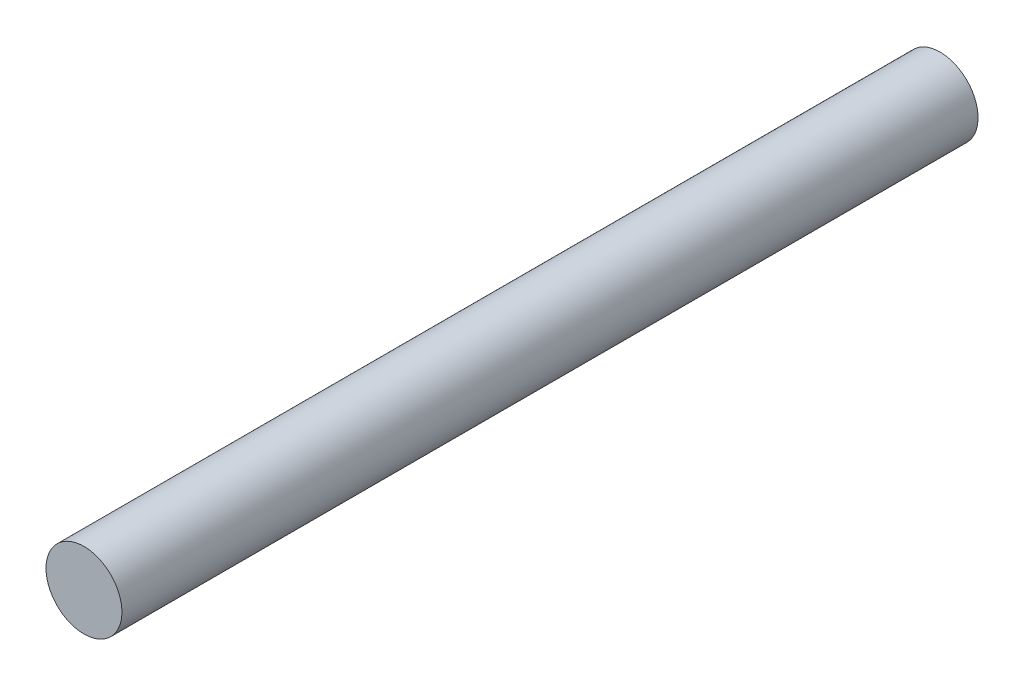
ISO-10303-21;
HEADER;
FILE_DESCRIPTION(('STEP AP214'),'2;1');
FILE_NAME('part.step','',(''),(''),'','','');
FILE_SCHEMA(('AUTOMOTIVE_DESIGN { 1 0 10303 214 1 1 1 1 }'));
ENDSEC;
DATA;
#1=APPLICATION_CONTEXT('core data for automotive mechanical design processes');
#2=APPLICATION_PROTOCOL_DEFINITION('international standard','automotive_design',2000,#1);
#3=PRODUCT_CONTEXT('',#1,'mechanical');
#4=PRODUCT('Part','Part','',(#3));
#5=PRODUCT_RELATED_PRODUCT_CATEGORY('part','',(#4));
#6=PRODUCT_DEFINITION_FORMATION('','',#4);
#7=PRODUCT_DEFINITION_CONTEXT('part definition',#1,'design');
#8=PRODUCT_DEFINITION('design','',#6,#7);
#9=PRODUCT_DEFINITION_SHAPE('','',#8);
#10=(LENGTH_UNIT() NAMED_UNIT(*) SI_UNIT(.MILLI.,.METRE.));
#11=(NAMED_UNIT(*) PLANE_ANGLE_UNIT() SI_UNIT($,.RADIAN.));
#12=(NAMED_UNIT(*) SI_UNIT($,.STERADIAN.) SOLID_ANGLE_UNIT());
#13=UNCERTAINTY_MEASURE_WITH_UNIT(LENGTH_MEASURE(1.E-05),#10,'distance_accuracy_value','');
#14=(GEOMETRIC_REPRESENTATION_CONTEXT(3) GLOBAL_UNCERTAINTY_ASSIGNED_CONTEXT((#13)) GLOBAL_UNIT_ASSIGNED_CONTEXT((#10,
#11,#12)) REPRESENTATION_CONTEXT('',''));
#15=CARTESIAN_POINT('',(0.,0.,0.));
#16=DIRECTION('',(0.,0.,1.));
#17=DIRECTION('',(1.,0.,0.));
#18=AXIS2_PLACEMENT_3D('',#15,#16,#17);
#19=CARTESIAN_POINT('',(0.,0.,76.2));
#20=DIRECTION('',(0.,0.,-1.));
#21=DIRECTION('',(-1.,0.,0.));
#22=AXIS2_PLACEMENT_3D('',#19,#20,#21);
#23=CYLINDRICAL_SURFACE('',#22,3.3782);
#24=CARTESIAN_POINT('',(0.,0.,76.2));
#25=DIRECTION('',(0.,0.,1.));
#26=DIRECTION('',(1.,0.,0.));
#27=AXIS2_PLACEMENT_3D('',#24,#25,#26);
#28=CIRCLE('',#27,3.3782);
#29=CARTESIAN_POINT('',(-3.3782,0.,76.2));
#30=VERTEX_POINT('',#29);
#31=EDGE_CURVE('E10',#30,#30,#28,.T.);
#32=CARTESIAN_POINT('',(0.,0.,0.));
#33=DIRECTION('',(0.,0.,1.));
#34=DIRECTION('',(1.,0.,0.));
#35=AXIS2_PLACEMENT_3D('',#32,#33,#34);
#36=CIRCLE('',#35,3.3782);
#37=CARTESIAN_POINT('',(-3.3782,0.,0.));
#38=VERTEX_POINT('',#37);
#39=EDGE_CURVE('E40',#38,#38,#36,.T.);
#40=CARTESIAN_POINT('',(-3.3782,0.,76.2));
#41=CARTESIAN_POINT('',(-3.3782,0.,75.40625));
#42=CARTESIAN_POINT('',(-3.3782,0.,74.6125));
#43=CARTESIAN_POINT('',(-3.3782,0.,73.025));
#44=CARTESIAN_POINT('',(-3.3782,0.,72.23125));
#45=CARTESIAN_POINT('',(-3.3782,0.,70.64375));
#46=CARTESIAN_POINT('',(-3.3782,0.,69.85));
#47=CARTESIAN_POINT('',(-3.3782,0.,68.2625));
#48=CARTESIAN_POINT('',(-3.3782,0.,67.46875));
#49=CARTESIAN_POINT('',(-3.3782,0.,65.88125));
#50=CARTESIAN_POINT('',(-3.3782,0.,65.0875));
#51=CARTESIAN_POINT('',(-3.3782,0.,63.5));
#52=CARTESIAN_POINT('',(-3.3782,0.,62.70625));
#53=CARTESIAN_POINT('',(-3.3782,0.,61.11875));
#54=CARTESIAN_POINT('',(-3.3782,0.,60.325));
#55=CARTESIAN_POINT('',(-3.3782,0.,58.7375));
#56=CARTESIAN_POINT('',(-3.3782,0.,57.94375));
#57=CARTESIAN_POINT('',(-3.3782,0.,56.35625));
#58=CARTESIAN_POINT('',(-3.3782,0.,55.5625));
#59=CARTESIAN_POINT('',(-3.3782,0.,53.975));
#60=CARTESIAN_POINT('',(-3.3782,0.,53.18125));
#61=CARTESIAN_POINT('',(-3.3782,0.,51.59375));
#62=CARTESIAN_POINT('',(-3.3782,0.,50.8));
#63=CARTESIAN_POINT('',(-3.3782,0.,49.2125));
#64=CARTESIAN_POINT('',(-3.3782,0.,48.41875));
#65=CARTESIAN_POINT('',(-3.3782,0.,46.83125));
#66=CARTESIAN_POINT('',(-3.3782,0.,46.0375));
#67=CARTESIAN_POINT('',(-3.3782,0.,44.45));
#68=CARTESIAN_POINT('',(-3.3782,0.,43.65625));
#69=CARTESIAN_POINT('',(-3.3782,0.,42.06875));
#70=CARTESIAN_POINT('',(-3.3782,0.,41.275));
#71=CARTESIAN_POINT('',(-3.3782,0.,39.6875));
#72=CARTESIAN_POINT('',(-3.3782,0.,38.89375));
#73=CARTESIAN_POINT('',(-3.3782,0.,37.30625));
#74=CARTESIAN_POINT('',(-3.3782,0.,36.5125));
#75=CARTESIAN_POINT('',(-3.3782,0.,34.925));
#76=CARTESIAN_POINT('',(-3.3782,0.,34.13125));
#77=CARTESIAN_POINT('',(-3.3782,0.,32.54375));
#78=CARTESIAN_POINT('',(-3.3782,0.,31.75));
#79=CARTESIAN_POINT('',(-3.3782,0.,30.1625));
#80=CARTESIAN_POINT('',(-3.3782,0.,29.36875));
#81=CARTESIAN_POINT('',(-3.3782,0.,27.78125));
#82=CARTESIAN_POINT('',(-3.3782,0.,26.9875));
#83=CARTESIAN_POINT('',(-3.3782,0.,25.4));
#84=CARTESIAN_POINT('',(-3.3782,0.,24.60625));
#85=CARTESIAN_POINT('',(-3.3782,0.,23.01875));
#86=CARTESIAN_POINT('',(-3.3782,0.,22.225));
#87=CARTESIAN_POINT('',(-3.3782,0.,20.6375));
#88=CARTESIAN_POINT('',(-3.3782,0.,19.84375));
#89=CARTESIAN_POINT('',(-3.3782,0.,18.25625));
#90=CARTESIAN_POINT('',(-3.3782,0.,17.4625));
#91=CARTESIAN_POINT('',(-3.3782,0.,15.875));
#92=CARTESIAN_POINT('',(-3.3782,0.,15.08125));
#93=CARTESIAN_POINT('',(-3.3782,0.,13.49375));
#94=CARTESIAN_POINT('',(-3.3782,0.,12.7));
#95=CARTESIAN_POINT('',(-3.3782,0.,11.1125));
#96=CARTESIAN_POINT('',(-3.3782,0.,10.31875));
#97=CARTESIAN_POINT('',(-3.3782,0.,8.73125));
#98=CARTESIAN_POINT('',(-3.3782,0.,7.93750000000001));
#99=CARTESIAN_POINT('',(-3.3782,0.,6.35));
#100=CARTESIAN_POINT('',(-3.3782,0.,5.55625));
#101=CARTESIAN_POINT('',(-3.3782,0.,3.96875));
#102=CARTESIAN_POINT('',(-3.3782,0.,3.175));
#103=CARTESIAN_POINT('',(-3.3782,0.,1.5875));
#104=CARTESIAN_POINT('',(-3.3782,0.,0.793750000000001));
#105=CARTESIAN_POINT('',(-3.3782,0.,0.));
#106=B_SPLINE_CURVE_WITH_KNOTS('',3,(#40,#41,#42,#43,#44,#45,#46,#47,#48,#49,#50,#51,#52,#53,
#54,#55,#56,#57,#58,#59,#60,#61,#62,#63,#64,#65,#66,#67,#68,#69,#70,#71,#72,#73,#74,#75,#76,#77,
#78,#79,#80,#81,#82,#83,#84,#85,#86,#87,#88,#89,#90,#91,#92,#93,#94,#95,#96,#97,#98,#99,#100,
#101,#102,#103,#104,#105),.UNSPECIFIED.,.F.,.F.,(4,2,2,2,2,2,2,2,2,2,2,2,2,2,2,2,2,2,2,2,2,2,2,
2,2,2,2,2,2,2,2,2,4),(0.,2.38125,4.7625,7.14375,9.52500000000001,11.90625,14.2875,16.66875,
19.05,21.43125,23.8125,26.19375,28.575,30.95625,33.3375,35.71875,38.1,40.48125,42.8625,45.24375,
47.625,50.00625,52.3875,54.76875,57.15,59.53125,61.9125,64.29375,66.675,69.05625,71.4375,
73.81875,76.2),.UNSPECIFIED.);
#107=EDGE_CURVE('BSEAM37',#30,#38,#106,.T.);
#108=ORIENTED_EDGE('',*,*,#31,.F.);
#109=ORIENTED_EDGE('',*,*,#39,.T.);
#110=ORIENTED_EDGE('',*,*,#107,.T.);
#111=ORIENTED_EDGE('',*,*,#107,.F.);
#112=EDGE_LOOP('',(#108,#110,#109,#111));
#113=FACE_BOUND('',#112,.T.);
#114=ADVANCED_FACE('F37',(#113),#23,.T.);
#115=CARTESIAN_POINT('',(0.,0.,76.2));
#116=DIRECTION('',(0.,0.,1.));
#117=DIRECTION('',(1.,0.,0.));
#118=AXIS2_PLACEMENT_3D('',#115,#116,#117);
#119=PLANE('',#118);
#120=ORIENTED_EDGE('',*,*,#31,.T.);
#121=EDGE_LOOP('',(#120));
#122=FACE_BOUND('',#121,.T.);
#123=ADVANCED_FACE('F54',(#122),#119,.T.);
#124=CARTESIAN_POINT('',(0.,0.,0.));
#125=DIRECTION('',(0.,0.,1.));
#126=DIRECTION('',(1.,0.,0.));
#127=AXIS2_PLACEMENT_3D('',#124,#125,#126);
#128=PLANE('',#127);
#129=ORIENTED_EDGE('',*,*,#39,.F.);
#130=EDGE_LOOP('',(#129));
#131=FACE_BOUND('',#130,.T.);
#132=ADVANCED_FACE('F52',(#131),#128,.F.);
#133=CLOSED_SHELL('',(#114,#123,#132));
#134=MANIFOLD_SOLID_BREP('B2',#133);
#135=ADVANCED_BREP_SHAPE_REPRESENTATION('',(#18,#134),#14);
#136=SHAPE_DEFINITION_REPRESENTATION(#9,#135);
ENDSEC;
END-ISO-10303-21;
